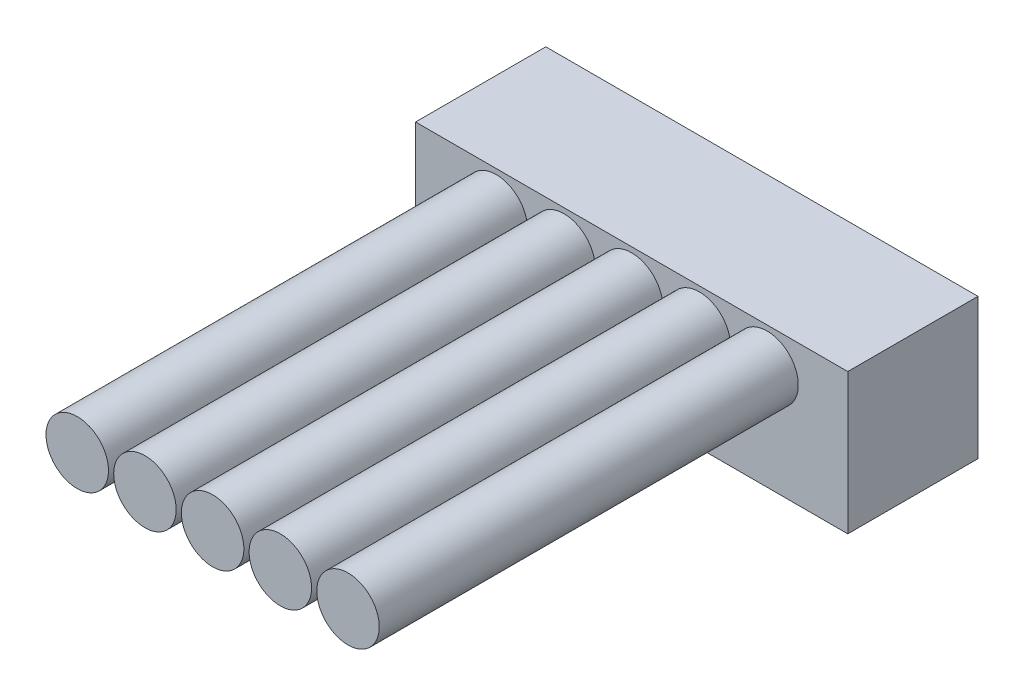
ISO-10303-21;
HEADER;
FILE_DESCRIPTION(('STEP AP214'),'2;1');
FILE_NAME('part.step','',(''),(''),'','','');
FILE_SCHEMA(('AUTOMOTIVE_DESIGN { 1 0 10303 214 1 1 1 1 }'));
ENDSEC;
DATA;
#1=APPLICATION_CONTEXT('core data for automotive mechanical design processes');
#2=APPLICATION_PROTOCOL_DEFINITION('international standard','automotive_design',2000,#1);
#3=PRODUCT_CONTEXT('',#1,'mechanical');
#4=PRODUCT('Part','Part','',(#3));
#5=PRODUCT_RELATED_PRODUCT_CATEGORY('part','',(#4));
#6=PRODUCT_DEFINITION_FORMATION('','',#4);
#7=PRODUCT_DEFINITION_CONTEXT('part definition',#1,'design');
#8=PRODUCT_DEFINITION('design','',#6,#7);
#9=PRODUCT_DEFINITION_SHAPE('','',#8);
#10=(LENGTH_UNIT() NAMED_UNIT(*) SI_UNIT(.MILLI.,.METRE.));
#11=(NAMED_UNIT(*) PLANE_ANGLE_UNIT() SI_UNIT($,.RADIAN.));
#12=(NAMED_UNIT(*) SI_UNIT($,.STERADIAN.) SOLID_ANGLE_UNIT());
#13=UNCERTAINTY_MEASURE_WITH_UNIT(LENGTH_MEASURE(1.E-05),#10,'distance_accuracy_value','');
#14=(GEOMETRIC_REPRESENTATION_CONTEXT(3) GLOBAL_UNCERTAINTY_ASSIGNED_CONTEXT((#13)) GLOBAL_UNIT_ASSIGNED_CONTEXT((#10,
#11,#12)) REPRESENTATION_CONTEXT('',''));
#15=CARTESIAN_POINT('',(0.,0.,0.));
#16=DIRECTION('',(0.,0.,1.));
#17=DIRECTION('',(1.,0.,0.));
#18=AXIS2_PLACEMENT_3D('',#15,#16,#17);
#19=CARTESIAN_POINT('',(4.15,2.7490000000047,-16.199));
#20=DIRECTION('',(1.,0.,0.));
#21=DIRECTION('',(0.,1.,0.));
#22=AXIS2_PLACEMENT_3D('',#19,#20,#21);
#23=PLANE('',#22);
#24=DIRECTION('',(0.,0.,-1.));
#25=VECTOR('',#24,1.);
#26=CARTESIAN_POINT('',(4.15,5.4500000000047,-17.4504827892858));
#27=LINE('',#26,#25);
#28=CARTESIAN_POINT('',(4.15,5.4500000000047,-16.2));
#29=VERTEX_POINT('',#28);
#30=CARTESIAN_POINT('',(4.15,5.4500000000047,-18.7009655785716));
#31=VERTEX_POINT('',#30);
#32=EDGE_CURVE('P0_E78',#29,#31,#27,.T.);
#33=ORIENTED_EDGE('',*,*,#32,.F.);
#34=DIRECTION('',(0.,1.,0.));
#35=VECTOR('',#34,1.);
#36=CARTESIAN_POINT('',(4.15,4.1000000000047,-16.2));
#37=LINE('',#36,#35);
#38=CARTESIAN_POINT('',(4.15,2.7500000000047,-16.2));
#39=VERTEX_POINT('',#38);
#40=EDGE_CURVE('P0_E25',#39,#29,#37,.T.);
#41=ORIENTED_EDGE('',*,*,#40,.F.);
#42=DIRECTION('',(0.,0.,1.));
#43=VECTOR('',#42,1.);
#44=CARTESIAN_POINT('',(4.15,2.7500000000047,-17.4504827892858));
#45=LINE('',#44,#43);
#46=CARTESIAN_POINT('',(4.15,2.75000000000469,-18.7009655785716));
#47=VERTEX_POINT('',#46);
#48=EDGE_CURVE('P0_E11',#47,#39,#45,.T.);
#49=ORIENTED_EDGE('',*,*,#48,.F.);
#50=DIRECTION('',(0.,-1.,0.));
#51=VECTOR('',#50,1.);
#52=CARTESIAN_POINT('',(4.15,4.1000000000047,-18.7009655785716));
#53=LINE('',#52,#51);
#54=EDGE_CURVE('P0_E103',#31,#47,#53,.T.);
#55=ORIENTED_EDGE('',*,*,#54,.F.);
#56=EDGE_LOOP('',(#33,#41,#49,#55));
#57=FACE_BOUND('',#56,.T.);
#58=ADVANCED_FACE('P0_F17',(#57),#23,.T.);
#59=CARTESIAN_POINT('',(-4.151,2.7500000000047,-18.7019655785716));
#60=DIRECTION('',(0.,-1.,0.));
#61=DIRECTION('',(0.,0.,-1.));
#62=AXIS2_PLACEMENT_3D('',#59,#60,#61);
#63=PLANE('',#62);
#64=DIRECTION('',(-1.,0.,0.));
#65=VECTOR('',#64,1.);
#66=CARTESIAN_POINT('',(0.,2.75000000000469,-18.7009655785716));
#67=LINE('',#66,#65);
#68=CARTESIAN_POINT('',(-4.15,2.75000000000469,-18.7009655785716));
#69=VERTEX_POINT('',#68);
#70=EDGE_CURVE('P0_E79',#47,#69,#67,.T.);
#71=ORIENTED_EDGE('',*,*,#70,.F.);
#72=ORIENTED_EDGE('',*,*,#48,.T.);
#73=DIRECTION('',(1.,0.,0.));
#74=VECTOR('',#73,1.);
#75=CARTESIAN_POINT('',(0.,2.7500000000047,-16.2));
#76=LINE('',#75,#74);
#77=CARTESIAN_POINT('',(-4.15,2.7500000000047,-16.2));
#78=VERTEX_POINT('',#77);
#79=EDGE_CURVE('P0_E112',#78,#39,#76,.T.);
#80=ORIENTED_EDGE('',*,*,#79,.F.);
#81=DIRECTION('',(0.,0.,1.));
#82=VECTOR('',#81,1.);
#83=CARTESIAN_POINT('',(-4.15,2.7500000000047,-17.4504827892858));
#84=LINE('',#83,#82);
#85=EDGE_CURVE('P0_E86',#69,#78,#84,.T.);
#86=ORIENTED_EDGE('',*,*,#85,.F.);
#87=EDGE_LOOP('',(#71,#72,#80,#86));
#88=FACE_BOUND('',#87,.T.);
#89=ADVANCED_FACE('P0_F120',(#88),#63,.T.);
#90=CARTESIAN_POINT('',(-4.151,2.7490000000047,-16.2));
#91=DIRECTION('',(0.,0.,1.));
#92=DIRECTION('',(1.,0.,0.));
#93=AXIS2_PLACEMENT_3D('',#90,#91,#92);
#94=PLANE('',#93);
#95=DIRECTION('',(1.,0.,0.));
#96=VECTOR('',#95,1.);
#97=CARTESIAN_POINT('',(0.,5.4500000000047,-16.2));
#98=LINE('',#97,#96);
#99=CARTESIAN_POINT('',(-4.15,5.4500000000047,-16.2));
#100=VERTEX_POINT('',#99);
#101=EDGE_CURVE('P0_E75',#100,#29,#98,.T.);
#102=ORIENTED_EDGE('',*,*,#101,.F.);
#103=DIRECTION('',(0.,1.,0.));
#104=VECTOR('',#103,1.);
#105=CARTESIAN_POINT('',(-4.15,4.1000000000047,-16.2));
#106=LINE('',#105,#104);
#107=EDGE_CURVE('P0_E72',#78,#100,#106,.T.);
#108=ORIENTED_EDGE('',*,*,#107,.F.);
#109=ORIENTED_EDGE('',*,*,#79,.T.);
#110=ORIENTED_EDGE('',*,*,#40,.T.);
#111=EDGE_LOOP('',(#102,#108,#109,#110));
#112=FACE_BOUND('',#111,.T.);
#113=ADVANCED_FACE('P0_F73',(#112),#94,.T.);
#114=CARTESIAN_POINT('',(-4.151,5.4500000000047,-18.7019655785716));
#115=DIRECTION('',(0.,1.,0.));
#116=DIRECTION('',(1.,0.,0.));
#117=AXIS2_PLACEMENT_3D('',#114,#115,#116);
#118=PLANE('',#117);
#119=DIRECTION('',(1.,0.,0.));
#120=VECTOR('',#119,1.);
#121=CARTESIAN_POINT('',(0.,5.45000000000469,-18.7009655785716));
#122=LINE('',#121,#120);
#123=CARTESIAN_POINT('',(-4.15,5.4500000000047,-18.7009655785716));
#124=VERTEX_POINT('',#123);
#125=EDGE_CURVE('P0_E89',#124,#31,#122,.T.);
#126=ORIENTED_EDGE('',*,*,#125,.F.);
#127=DIRECTION('',(0.,0.,-1.));
#128=VECTOR('',#127,1.);
#129=CARTESIAN_POINT('',(-4.15,5.4500000000047,-17.4504827892858));
#130=LINE('',#129,#128);
#131=EDGE_CURVE('P0_E88',#100,#124,#130,.T.);
#132=ORIENTED_EDGE('',*,*,#131,.F.);
#133=ORIENTED_EDGE('',*,*,#101,.T.);
#134=ORIENTED_EDGE('',*,*,#32,.T.);
#135=EDGE_LOOP('',(#126,#132,#133,#134));
#136=FACE_BOUND('',#135,.T.);
#137=ADVANCED_FACE('P0_F95',(#136),#118,.T.);
#138=CARTESIAN_POINT('',(4.151,2.7490000000047,-18.7009655785716));
#139=DIRECTION('',(0.,0.,-1.));
#140=DIRECTION('',(0.,-1.,0.));
#141=AXIS2_PLACEMENT_3D('',#138,#139,#140);
#142=PLANE('',#141);
#143=ORIENTED_EDGE('',*,*,#125,.T.);
#144=ORIENTED_EDGE('',*,*,#54,.T.);
#145=ORIENTED_EDGE('',*,*,#70,.T.);
#146=DIRECTION('',(0.,-1.,0.));
#147=VECTOR('',#146,1.);
#148=CARTESIAN_POINT('',(-4.15,4.1000000000047,-18.7009655785716));
#149=LINE('',#148,#147);
#150=EDGE_CURVE('P0_E96',#124,#69,#149,.T.);
#151=ORIENTED_EDGE('',*,*,#150,.F.);
#152=EDGE_LOOP('',(#143,#144,#145,#151));
#153=FACE_BOUND('',#152,.T.);
#154=ADVANCED_FACE('P0_F125',(#153),#142,.T.);
#155=CARTESIAN_POINT('',(-4.15,2.7490000000047,-18.7019655785716));
#156=DIRECTION('',(-1.,0.,0.));
#157=DIRECTION('',(0.,0.,1.));
#158=AXIS2_PLACEMENT_3D('',#155,#156,#157);
#159=PLANE('',#158);
#160=ORIENTED_EDGE('',*,*,#131,.T.);
#161=ORIENTED_EDGE('',*,*,#150,.T.);
#162=ORIENTED_EDGE('',*,*,#85,.T.);
#163=ORIENTED_EDGE('',*,*,#107,.T.);
#164=EDGE_LOOP('',(#160,#161,#162,#163));
#165=FACE_BOUND('',#164,.T.);
#166=ADVANCED_FACE('P0_F82',(#165),#159,.T.);
#167=CLOSED_SHELL('',(#58,#89,#113,#137,#154,#166));
#168=MANIFOLD_SOLID_BREP('P0_B1',#167);
#169=CARTESIAN_POINT('',(1.999,5.3510000000047,-16.2));
#170=DIRECTION('',(0.,0.,-1.));
#171=DIRECTION('',(0.,-1.,0.));
#172=AXIS2_PLACEMENT_3D('',#169,#170,#171);
#173=PLANE('',#172);
#174=CARTESIAN_POINT('',(2.6,4.7500000000047,-16.2));
#175=DIRECTION('',(0.,0.,1.));
#176=DIRECTION('',(-1.,0.,0.));
#177=AXIS2_PLACEMENT_3D('',#174,#175,#176);
#178=CIRCLE('',#177,0.6);
#179=CARTESIAN_POINT('',(2.,4.7500000000047,-16.2));
#180=VERTEX_POINT('',#179);
#181=EDGE_CURVE('P1_E10',#180,#180,#178,.T.);
#182=ORIENTED_EDGE('',*,*,#181,.F.);
#183=EDGE_LOOP('',(#182));
#184=FACE_BOUND('',#183,.T.);
#185=ADVANCED_FACE('P1_F15',(#184),#173,.T.);
#186=CARTESIAN_POINT('',(3.201,5.3510000000047,-8.15286688188486));
#187=DIRECTION('',(0.,0.,1.));
#188=DIRECTION('',(1.,0.,0.));
#189=AXIS2_PLACEMENT_3D('',#186,#187,#188);
#190=PLANE('',#189);
#191=CARTESIAN_POINT('',(2.6,4.7500000000047,-8.15286688188486));
#192=DIRECTION('',(0.,0.,1.));
#193=DIRECTION('',(-1.,0.,0.));
#194=AXIS2_PLACEMENT_3D('',#191,#192,#193);
#195=CIRCLE('',#194,0.6);
#196=CARTESIAN_POINT('',(2.,4.7500000000047,-8.15286688188486));
#197=VERTEX_POINT('',#196);
#198=EDGE_CURVE('P1_E22',#197,#197,#195,.T.);
#199=ORIENTED_EDGE('',*,*,#198,.T.);
#200=EDGE_LOOP('',(#199));
#201=FACE_BOUND('',#200,.T.);
#202=ADVANCED_FACE('P1_F34',(#201),#190,.T.);
#203=CARTESIAN_POINT('',(2.6,4.7500000000047,-8.15286688188486));
#204=DIRECTION('',(0.,0.,-1.));
#205=DIRECTION('',(-1.,0.,0.));
#206=AXIS2_PLACEMENT_3D('',#203,#204,#205);
#207=CYLINDRICAL_SURFACE('',#206,0.6);
#208=ORIENTED_EDGE('',*,*,#181,.T.);
#209=EDGE_LOOP('',(#208));
#210=FACE_BOUND('',#209,.T.);
#211=ORIENTED_EDGE('',*,*,#198,.F.);
#212=EDGE_LOOP('',(#211));
#213=FACE_BOUND('',#212,.T.);
#214=ADVANCED_FACE('P1_F40',(#210,#213),#207,.T.);
#215=CLOSED_SHELL('',(#185,#202,#214));
#216=MANIFOLD_SOLID_BREP('P1_B1',#215);
#217=CARTESIAN_POINT('',(-3.201,5.3510000000047,-16.2));
#218=DIRECTION('',(0.,0.,-1.));
#219=DIRECTION('',(0.,-1.,0.));
#220=AXIS2_PLACEMENT_3D('',#217,#218,#219);
#221=PLANE('',#220);
#222=CARTESIAN_POINT('',(-2.6,4.7500000000047,-16.2));
#223=DIRECTION('',(0.,0.,1.));
#224=DIRECTION('',(-1.,0.,0.));
#225=AXIS2_PLACEMENT_3D('',#222,#223,#224);
#226=CIRCLE('',#225,0.6);
#227=CARTESIAN_POINT('',(-3.2,4.7500000000047,-16.2));
#228=VERTEX_POINT('',#227);
#229=EDGE_CURVE('P2_E10',#228,#228,#226,.T.);
#230=ORIENTED_EDGE('',*,*,#229,.F.);
#231=EDGE_LOOP('',(#230));
#232=FACE_BOUND('',#231,.T.);
#233=ADVANCED_FACE('P2_F15',(#232),#221,.T.);
#234=CARTESIAN_POINT('',(-1.999,5.3510000000047,-8.15286688188486));
#235=DIRECTION('',(0.,0.,1.));
#236=DIRECTION('',(1.,0.,0.));
#237=AXIS2_PLACEMENT_3D('',#234,#235,#236);
#238=PLANE('',#237);
#239=CARTESIAN_POINT('',(-2.6,4.7500000000047,-8.15286688188486));
#240=DIRECTION('',(0.,0.,1.));
#241=DIRECTION('',(-1.,0.,0.));
#242=AXIS2_PLACEMENT_3D('',#239,#240,#241);
#243=CIRCLE('',#242,0.6);
#244=CARTESIAN_POINT('',(-3.2,4.7500000000047,-8.15286688188486));
#245=VERTEX_POINT('',#244);
#246=EDGE_CURVE('P2_E22',#245,#245,#243,.T.);
#247=ORIENTED_EDGE('',*,*,#246,.T.);
#248=EDGE_LOOP('',(#247));
#249=FACE_BOUND('',#248,.T.);
#250=ADVANCED_FACE('P2_F34',(#249),#238,.T.);
#251=CARTESIAN_POINT('',(-2.6,4.7500000000047,-8.15286688188486));
#252=DIRECTION('',(0.,0.,-1.));
#253=DIRECTION('',(-1.,0.,0.));
#254=AXIS2_PLACEMENT_3D('',#251,#252,#253);
#255=CYLINDRICAL_SURFACE('',#254,0.6);
#256=ORIENTED_EDGE('',*,*,#229,.T.);
#257=EDGE_LOOP('',(#256));
#258=FACE_BOUND('',#257,.T.);
#259=ORIENTED_EDGE('',*,*,#246,.F.);
#260=EDGE_LOOP('',(#259));
#261=FACE_BOUND('',#260,.T.);
#262=ADVANCED_FACE('P2_F40',(#258,#261),#255,.T.);
#263=CLOSED_SHELL('',(#233,#250,#262));
#264=MANIFOLD_SOLID_BREP('P2_B1',#263);
#265=CARTESIAN_POINT('',(-0.601,5.3510000000047,-16.2));
#266=DIRECTION('',(0.,0.,-1.));
#267=DIRECTION('',(0.,-1.,0.));
#268=AXIS2_PLACEMENT_3D('',#265,#266,#267);
#269=PLANE('',#268);
#270=CARTESIAN_POINT('',(0.,4.7500000000047,-16.2));
#271=DIRECTION('',(0.,0.,1.));
#272=DIRECTION('',(-1.,0.,0.));
#273=AXIS2_PLACEMENT_3D('',#270,#271,#272);
#274=CIRCLE('',#273,0.6);
#275=CARTESIAN_POINT('',(-0.599999999999999,4.7500000000047,-16.2));
#276=VERTEX_POINT('',#275);
#277=EDGE_CURVE('P3_E10',#276,#276,#274,.T.);
#278=ORIENTED_EDGE('',*,*,#277,.F.);
#279=EDGE_LOOP('',(#278));
#280=FACE_BOUND('',#279,.T.);
#281=ADVANCED_FACE('P3_F15',(#280),#269,.T.);
#282=CARTESIAN_POINT('',(0.601,5.3510000000047,-8.15286688188486));
#283=DIRECTION('',(0.,0.,1.));
#284=DIRECTION('',(1.,0.,0.));
#285=AXIS2_PLACEMENT_3D('',#282,#283,#284);
#286=PLANE('',#285);
#287=CARTESIAN_POINT('',(0.,4.7500000000047,-8.15286688188486));
#288=DIRECTION('',(0.,0.,1.));
#289=DIRECTION('',(-1.,0.,0.));
#290=AXIS2_PLACEMENT_3D('',#287,#288,#289);
#291=CIRCLE('',#290,0.6);
#292=CARTESIAN_POINT('',(-0.599999999999999,4.7500000000047,-8.15286688188486));
#293=VERTEX_POINT('',#292);
#294=EDGE_CURVE('P3_E22',#293,#293,#291,.T.);
#295=ORIENTED_EDGE('',*,*,#294,.T.);
#296=EDGE_LOOP('',(#295));
#297=FACE_BOUND('',#296,.T.);
#298=ADVANCED_FACE('P3_F34',(#297),#286,.T.);
#299=CARTESIAN_POINT('',(0.,4.7500000000047,-8.15286688188486));
#300=DIRECTION('',(0.,0.,-1.));
#301=DIRECTION('',(-1.,0.,0.));
#302=AXIS2_PLACEMENT_3D('',#299,#300,#301);
#303=CYLINDRICAL_SURFACE('',#302,0.6);
#304=ORIENTED_EDGE('',*,*,#277,.T.);
#305=EDGE_LOOP('',(#304));
#306=FACE_BOUND('',#305,.T.);
#307=ORIENTED_EDGE('',*,*,#294,.F.);
#308=EDGE_LOOP('',(#307));
#309=FACE_BOUND('',#308,.T.);
#310=ADVANCED_FACE('P3_F40',(#306,#309),#303,.T.);
#311=CLOSED_SHELL('',(#281,#298,#310));
#312=MANIFOLD_SOLID_BREP('P3_B1',#311);
#313=CARTESIAN_POINT('',(0.699,5.3510000000047,-16.2));
#314=DIRECTION('',(0.,0.,-1.));
#315=DIRECTION('',(0.,-1.,0.));
#316=AXIS2_PLACEMENT_3D('',#313,#314,#315);
#317=PLANE('',#316);
#318=CARTESIAN_POINT('',(1.3,4.7500000000047,-16.2));
#319=DIRECTION('',(0.,0.,1.));
#320=DIRECTION('',(-1.,0.,0.));
#321=AXIS2_PLACEMENT_3D('',#318,#319,#320);
#322=CIRCLE('',#321,0.6);
#323=CARTESIAN_POINT('',(0.7,4.7500000000047,-16.2));
#324=VERTEX_POINT('',#323);
#325=EDGE_CURVE('P4_E10',#324,#324,#322,.T.);
#326=ORIENTED_EDGE('',*,*,#325,.F.);
#327=EDGE_LOOP('',(#326));
#328=FACE_BOUND('',#327,.T.);
#329=ADVANCED_FACE('P4_F15',(#328),#317,.T.);
#330=CARTESIAN_POINT('',(1.901,5.3510000000047,-8.15286688188486));
#331=DIRECTION('',(0.,0.,1.));
#332=DIRECTION('',(1.,0.,0.));
#333=AXIS2_PLACEMENT_3D('',#330,#331,#332);
#334=PLANE('',#333);
#335=CARTESIAN_POINT('',(1.3,4.7500000000047,-8.15286688188486));
#336=DIRECTION('',(0.,0.,1.));
#337=DIRECTION('',(-1.,0.,0.));
#338=AXIS2_PLACEMENT_3D('',#335,#336,#337);
#339=CIRCLE('',#338,0.6);
#340=CARTESIAN_POINT('',(0.7,4.7500000000047,-8.15286688188486));
#341=VERTEX_POINT('',#340);
#342=EDGE_CURVE('P4_E22',#341,#341,#339,.T.);
#343=ORIENTED_EDGE('',*,*,#342,.T.);
#344=EDGE_LOOP('',(#343));
#345=FACE_BOUND('',#344,.T.);
#346=ADVANCED_FACE('P4_F34',(#345),#334,.T.);
#347=CARTESIAN_POINT('',(1.3,4.7500000000047,-8.15286688188486));
#348=DIRECTION('',(0.,0.,-1.));
#349=DIRECTION('',(-1.,0.,0.));
#350=AXIS2_PLACEMENT_3D('',#347,#348,#349);
#351=CYLINDRICAL_SURFACE('',#350,0.6);
#352=ORIENTED_EDGE('',*,*,#325,.T.);
#353=EDGE_LOOP('',(#352));
#354=FACE_BOUND('',#353,.T.);
#355=ORIENTED_EDGE('',*,*,#342,.F.);
#356=EDGE_LOOP('',(#355));
#357=FACE_BOUND('',#356,.T.);
#358=ADVANCED_FACE('P4_F40',(#354,#357),#351,.T.);
#359=CLOSED_SHELL('',(#329,#346,#358));
#360=MANIFOLD_SOLID_BREP('P4_B1',#359);
#361=CARTESIAN_POINT('',(-1.901,5.3510000000047,-16.2));
#362=DIRECTION('',(0.,0.,-1.));
#363=DIRECTION('',(0.,-1.,0.));
#364=AXIS2_PLACEMENT_3D('',#361,#362,#363);
#365=PLANE('',#364);
#366=CARTESIAN_POINT('',(-1.3,4.7500000000047,-16.2));
#367=DIRECTION('',(0.,0.,1.));
#368=DIRECTION('',(-1.,0.,0.));
#369=AXIS2_PLACEMENT_3D('',#366,#367,#368);
#370=CIRCLE('',#369,0.6);
#371=CARTESIAN_POINT('',(-1.9,4.7500000000047,-16.2));
#372=VERTEX_POINT('',#371);
#373=EDGE_CURVE('P5_E10',#372,#372,#370,.T.);
#374=ORIENTED_EDGE('',*,*,#373,.F.);
#375=EDGE_LOOP('',(#374));
#376=FACE_BOUND('',#375,.T.);
#377=ADVANCED_FACE('P5_F15',(#376),#365,.T.);
#378=CARTESIAN_POINT('',(-0.699,5.3510000000047,-8.15286688188486));
#379=DIRECTION('',(0.,0.,1.));
#380=DIRECTION('',(1.,0.,0.));
#381=AXIS2_PLACEMENT_3D('',#378,#379,#380);
#382=PLANE('',#381);
#383=CARTESIAN_POINT('',(-1.3,4.7500000000047,-8.15286688188486));
#384=DIRECTION('',(0.,0.,1.));
#385=DIRECTION('',(-1.,0.,0.));
#386=AXIS2_PLACEMENT_3D('',#383,#384,#385);
#387=CIRCLE('',#386,0.6);
#388=CARTESIAN_POINT('',(-1.9,4.7500000000047,-8.15286688188486));
#389=VERTEX_POINT('',#388);
#390=EDGE_CURVE('P5_E22',#389,#389,#387,.T.);
#391=ORIENTED_EDGE('',*,*,#390,.T.);
#392=EDGE_LOOP('',(#391));
#393=FACE_BOUND('',#392,.T.);
#394=ADVANCED_FACE('P5_F34',(#393),#382,.T.);
#395=CARTESIAN_POINT('',(-1.3,4.7500000000047,-8.15286688188486));
#396=DIRECTION('',(0.,0.,-1.));
#397=DIRECTION('',(-1.,0.,0.));
#398=AXIS2_PLACEMENT_3D('',#395,#396,#397);
#399=CYLINDRICAL_SURFACE('',#398,0.6);
#400=ORIENTED_EDGE('',*,*,#373,.T.);
#401=EDGE_LOOP('',(#400));
#402=FACE_BOUND('',#401,.T.);
#403=ORIENTED_EDGE('',*,*,#390,.F.);
#404=EDGE_LOOP('',(#403));
#405=FACE_BOUND('',#404,.T.);
#406=ADVANCED_FACE('P5_F40',(#402,#405),#399,.T.);
#407=CLOSED_SHELL('',(#377,#394,#406));
#408=MANIFOLD_SOLID_BREP('P5_B1',#407);
#409=ADVANCED_BREP_SHAPE_REPRESENTATION('',(#18,#168,#216,#264,#312,#360,#408),#14);
#410=SHAPE_DEFINITION_REPRESENTATION(#9,#409);
ENDSEC;
END-ISO-10303-21;
